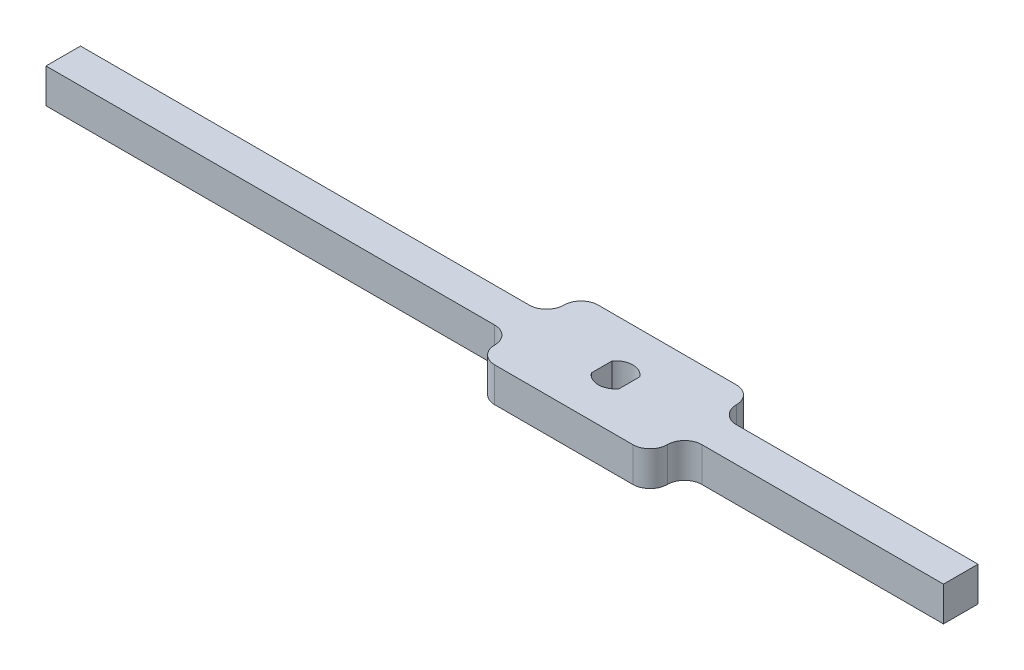
ISO-10303-21;
HEADER;
FILE_DESCRIPTION(('STEP AP214'),'2;1');
FILE_NAME('part.step','',(''),(''),'','','');
FILE_SCHEMA(('AUTOMOTIVE_DESIGN { 1 0 10303 214 1 1 1 1 }'));
ENDSEC;
DATA;
#1=APPLICATION_CONTEXT('core data for automotive mechanical design processes');
#2=APPLICATION_PROTOCOL_DEFINITION('international standard','automotive_design',2000,#1);
#3=PRODUCT_CONTEXT('',#1,'mechanical');
#4=PRODUCT('Part','Part','',(#3));
#5=PRODUCT_RELATED_PRODUCT_CATEGORY('part','',(#4));
#6=PRODUCT_DEFINITION_FORMATION('','',#4);
#7=PRODUCT_DEFINITION_CONTEXT('part definition',#1,'design');
#8=PRODUCT_DEFINITION('design','',#6,#7);
#9=PRODUCT_DEFINITION_SHAPE('','',#8);
#10=(LENGTH_UNIT() NAMED_UNIT(*) SI_UNIT(.MILLI.,.METRE.));
#11=(NAMED_UNIT(*) PLANE_ANGLE_UNIT() SI_UNIT($,.RADIAN.));
#12=(NAMED_UNIT(*) SI_UNIT($,.STERADIAN.) SOLID_ANGLE_UNIT());
#13=UNCERTAINTY_MEASURE_WITH_UNIT(LENGTH_MEASURE(1.E-05),#10,'distance_accuracy_value','');
#14=(GEOMETRIC_REPRESENTATION_CONTEXT(3) GLOBAL_UNCERTAINTY_ASSIGNED_CONTEXT((#13)) GLOBAL_UNIT_ASSIGNED_CONTEXT((#10,
#11,#12)) REPRESENTATION_CONTEXT('',''));
#15=CARTESIAN_POINT('',(0.,0.,0.));
#16=DIRECTION('',(0.,0.,1.));
#17=DIRECTION('',(1.,0.,0.));
#18=AXIS2_PLACEMENT_3D('',#15,#16,#17);
#19=CARTESIAN_POINT('',(0.,10.,0.));
#20=DIRECTION('',(0.,-1.,0.));
#21=DIRECTION('',(0.,0.,-1.));
#22=AXIS2_PLACEMENT_3D('',#19,#20,#21);
#23=PLANE('',#22);
#24=DIRECTION('',(1.,0.,0.));
#25=VECTOR('',#24,1.);
#26=CARTESIAN_POINT('',(-25.,10.,15.));
#27=LINE('',#26,#25);
#28=CARTESIAN_POINT('',(-20.,10.,15.));
#29=VERTEX_POINT('',#28);
#30=CARTESIAN_POINT('',(20.,10.,15.));
#31=VERTEX_POINT('',#30);
#32=EDGE_CURVE('E291',#29,#31,#27,.T.);
#33=ORIENTED_EDGE('',*,*,#32,.T.);
#34=CARTESIAN_POINT('',(20.,10.,10.));
#35=DIRECTION('',(0.,-1.,0.));
#36=DIRECTION('',(0.,0.,-1.));
#37=AXIS2_PLACEMENT_3D('',#34,#35,#36);
#38=CIRCLE('',#37,5.);
#39=CARTESIAN_POINT('',(25.,10.,9.99999999999998));
#40=VERTEX_POINT('',#39);
#41=EDGE_CURVE('E382',#31,#40,#38,.F.);
#42=ORIENTED_EDGE('',*,*,#41,.T.);
#43=CARTESIAN_POINT('',(30.,10.,9.99999999999998));
#44=DIRECTION('',(0.,-1.,0.));
#45=DIRECTION('',(0.,0.,-1.));
#46=AXIS2_PLACEMENT_3D('',#43,#44,#45);
#47=CIRCLE('',#46,5.);
#48=CARTESIAN_POINT('',(30.,10.,4.99999999999998));
#49=VERTEX_POINT('',#48);
#50=EDGE_CURVE('E352',#40,#49,#47,.T.);
#51=ORIENTED_EDGE('',*,*,#50,.T.);
#52=DIRECTION('',(1.,0.,0.));
#53=VECTOR('',#52,1.);
#54=CARTESIAN_POINT('',(25.,10.,4.99999999999998));
#55=LINE('',#54,#53);
#56=CARTESIAN_POINT('',(100.,10.,4.99999999999998));
#57=VERTEX_POINT('',#56);
#58=EDGE_CURVE('E216',#49,#57,#55,.T.);
#59=ORIENTED_EDGE('',*,*,#58,.T.);
#60=DIRECTION('',(0.,0.,-1.));
#61=VECTOR('',#60,1.);
#62=CARTESIAN_POINT('',(100.,10.,4.99999999999998));
#63=LINE('',#62,#61);
#64=CARTESIAN_POINT('',(100.,10.0000000000001,-5.00000000000002));
#65=VERTEX_POINT('',#64);
#66=EDGE_CURVE('E211',#57,#65,#63,.T.);
#67=ORIENTED_EDGE('',*,*,#66,.T.);
#68=DIRECTION('',(-1.,0.,0.));
#69=VECTOR('',#68,1.);
#70=CARTESIAN_POINT('',(100.,10.,-5.00000000000002));
#71=LINE('',#70,#69);
#72=CARTESIAN_POINT('',(30.,10.,-5.00000000000003));
#73=VERTEX_POINT('',#72);
#74=EDGE_CURVE('E195',#65,#73,#71,.T.);
#75=ORIENTED_EDGE('',*,*,#74,.T.);
#76=CARTESIAN_POINT('',(30.,10.,-10.));
#77=DIRECTION('',(0.,-1.,0.));
#78=DIRECTION('',(0.,0.,-1.));
#79=AXIS2_PLACEMENT_3D('',#76,#77,#78);
#80=CIRCLE('',#79,5.);
#81=CARTESIAN_POINT('',(25.,10.,-10.));
#82=VERTEX_POINT('',#81);
#83=EDGE_CURVE('E346',#73,#82,#80,.T.);
#84=ORIENTED_EDGE('',*,*,#83,.T.);
#85=CARTESIAN_POINT('',(20.,10.,-10.));
#86=DIRECTION('',(0.,-1.,0.));
#87=DIRECTION('',(0.,0.,-1.));
#88=AXIS2_PLACEMENT_3D('',#85,#86,#87);
#89=CIRCLE('',#88,5.);
#90=CARTESIAN_POINT('',(20.,10.,-15.));
#91=VERTEX_POINT('',#90);
#92=EDGE_CURVE('E59',#82,#91,#89,.F.);
#93=ORIENTED_EDGE('',*,*,#92,.T.);
#94=DIRECTION('',(-1.,0.,0.));
#95=VECTOR('',#94,1.);
#96=CARTESIAN_POINT('',(-25.,10.,-15.));
#97=LINE('',#96,#95);
#98=CARTESIAN_POINT('',(-20.,10.,-15.));
#99=VERTEX_POINT('',#98);
#100=EDGE_CURVE('E288',#91,#99,#97,.T.);
#101=ORIENTED_EDGE('',*,*,#100,.T.);
#102=CARTESIAN_POINT('',(-20.,10.,-10.));
#103=DIRECTION('',(0.,-1.,0.));
#104=DIRECTION('',(0.,0.,-1.));
#105=AXIS2_PLACEMENT_3D('',#102,#103,#104);
#106=CIRCLE('',#105,5.);
#107=CARTESIAN_POINT('',(-25.,10.,-10.));
#108=VERTEX_POINT('',#107);
#109=EDGE_CURVE('E376',#99,#108,#106,.F.);
#110=ORIENTED_EDGE('',*,*,#109,.T.);
#111=CARTESIAN_POINT('',(-30.,10.,-10.));
#112=DIRECTION('',(0.,-1.,0.));
#113=DIRECTION('',(0.,0.,-1.));
#114=AXIS2_PLACEMENT_3D('',#111,#112,#113);
#115=CIRCLE('',#114,5.);
#116=CARTESIAN_POINT('',(-30.,10.,-5.00000000000002));
#117=VERTEX_POINT('',#116);
#118=EDGE_CURVE('E341',#108,#117,#115,.T.);
#119=ORIENTED_EDGE('',*,*,#118,.T.);
#120=DIRECTION('',(-1.,0.,0.));
#121=VECTOR('',#120,1.);
#122=CARTESIAN_POINT('',(-160.,10.,-5.00000000000002));
#123=LINE('',#122,#121);
#124=CARTESIAN_POINT('',(-160.,10.,-5.00000000000002));
#125=VERTEX_POINT('',#124);
#126=EDGE_CURVE('E220',#117,#125,#123,.T.);
#127=ORIENTED_EDGE('',*,*,#126,.T.);
#128=DIRECTION('',(0.,0.,1.));
#129=VECTOR('',#128,1.);
#130=CARTESIAN_POINT('',(-160.,10.,4.99999999999998));
#131=LINE('',#130,#129);
#132=CARTESIAN_POINT('',(-160.,10.0000000000001,4.99999999999998));
#133=VERTEX_POINT('',#132);
#134=EDGE_CURVE('E217',#125,#133,#131,.T.);
#135=ORIENTED_EDGE('',*,*,#134,.T.);
#136=DIRECTION('',(1.,0.,0.));
#137=VECTOR('',#136,1.);
#138=CARTESIAN_POINT('',(-25.,10.,5.));
#139=LINE('',#138,#137);
#140=CARTESIAN_POINT('',(-30.,10.,5.));
#141=VERTEX_POINT('',#140);
#142=EDGE_CURVE('E224',#133,#141,#139,.T.);
#143=ORIENTED_EDGE('',*,*,#142,.T.);
#144=CARTESIAN_POINT('',(-30.,10.,10.));
#145=DIRECTION('',(0.,-1.,0.));
#146=DIRECTION('',(0.,0.,-1.));
#147=AXIS2_PLACEMENT_3D('',#144,#145,#146);
#148=CIRCLE('',#147,5.);
#149=CARTESIAN_POINT('',(-25.,10.,10.));
#150=VERTEX_POINT('',#149);
#151=EDGE_CURVE('E334',#141,#150,#148,.T.);
#152=ORIENTED_EDGE('',*,*,#151,.T.);
#153=CARTESIAN_POINT('',(-20.,10.,10.));
#154=DIRECTION('',(0.,-1.,0.));
#155=DIRECTION('',(0.,0.,-1.));
#156=AXIS2_PLACEMENT_3D('',#153,#154,#155);
#157=CIRCLE('',#156,5.);
#158=EDGE_CURVE('E379',#150,#29,#157,.F.);
#159=ORIENTED_EDGE('',*,*,#158,.T.);
#160=EDGE_LOOP('',(#33,#42,#51,#59,#67,#75,#84,#93,#101,#110,#119,#127,#135,#143,#152,#159));
#161=FACE_BOUND('',#160,.T.);
#162=CARTESIAN_POINT('',(0.,10.,0.));
#163=DIRECTION('',(0.,1.,0.));
#164=DIRECTION('',(0.,0.,1.));
#165=AXIS2_PLACEMENT_3D('',#162,#163,#164);
#166=CIRCLE('',#165,5.);
#167=CARTESIAN_POINT('',(4.,10.,-3.));
#168=VERTEX_POINT('',#167);
#169=CARTESIAN_POINT('',(-4.,10.,-3.));
#170=VERTEX_POINT('',#169);
#171=EDGE_CURVE('E245',#168,#170,#166,.T.);
#172=ORIENTED_EDGE('',*,*,#171,.F.);
#173=DIRECTION('',(0.,0.,-1.));
#174=VECTOR('',#173,1.);
#175=CARTESIAN_POINT('',(4.,10.,-3.));
#176=LINE('',#175,#174);
#177=CARTESIAN_POINT('',(4.,10.,3.));
#178=VERTEX_POINT('',#177);
#179=EDGE_CURVE('E256',#178,#168,#176,.T.);
#180=ORIENTED_EDGE('',*,*,#179,.F.);
#181=CARTESIAN_POINT('',(0.,10.,0.));
#182=DIRECTION('',(0.,1.,0.));
#183=DIRECTION('',(0.,0.,1.));
#184=AXIS2_PLACEMENT_3D('',#181,#182,#183);
#185=CIRCLE('',#184,5.);
#186=CARTESIAN_POINT('',(-4.,10.,3.));
#187=VERTEX_POINT('',#186);
#188=EDGE_CURVE('E252',#187,#178,#185,.T.);
#189=ORIENTED_EDGE('',*,*,#188,.F.);
#190=DIRECTION('',(0.,0.,1.));
#191=VECTOR('',#190,1.);
#192=CARTESIAN_POINT('',(-4.,10.,-3.));
#193=LINE('',#192,#191);
#194=EDGE_CURVE('E248',#170,#187,#193,.T.);
#195=ORIENTED_EDGE('',*,*,#194,.F.);
#196=EDGE_LOOP('',(#172,#180,#189,#195));
#197=FACE_BOUND('',#196,.T.);
#198=ADVANCED_FACE('F38',(#161,#197),#23,.F.);
#199=CARTESIAN_POINT('',(0.,0.,0.));
#200=DIRECTION('',(0.,-1.,0.));
#201=DIRECTION('',(0.,0.,-1.));
#202=AXIS2_PLACEMENT_3D('',#199,#200,#201);
#203=PLANE('',#202);
#204=CARTESIAN_POINT('',(30.,0.,9.99999999999998));
#205=DIRECTION('',(0.,-1.,0.));
#206=DIRECTION('',(0.,0.,-1.));
#207=AXIS2_PLACEMENT_3D('',#204,#205,#206);
#208=CIRCLE('',#207,5.);
#209=CARTESIAN_POINT('',(30.,0.,4.99999999999998));
#210=VERTEX_POINT('',#209);
#211=CARTESIAN_POINT('',(25.,0.,9.99999999999998));
#212=VERTEX_POINT('',#211);
#213=EDGE_CURVE('E349',#210,#212,#208,.F.);
#214=ORIENTED_EDGE('',*,*,#213,.T.);
#215=CARTESIAN_POINT('',(20.,0.,10.));
#216=DIRECTION('',(0.,-1.,0.));
#217=DIRECTION('',(0.,0.,-1.));
#218=AXIS2_PLACEMENT_3D('',#215,#216,#217);
#219=CIRCLE('',#218,5.);
#220=CARTESIAN_POINT('',(20.,0.,15.));
#221=VERTEX_POINT('',#220);
#222=EDGE_CURVE('E364',#212,#221,#219,.T.);
#223=ORIENTED_EDGE('',*,*,#222,.T.);
#224=DIRECTION('',(1.,0.,0.));
#225=VECTOR('',#224,1.);
#226=CARTESIAN_POINT('',(-25.,0.,15.));
#227=LINE('',#226,#225);
#228=CARTESIAN_POINT('',(-20.,0.,15.));
#229=VERTEX_POINT('',#228);
#230=EDGE_CURVE('E292',#229,#221,#227,.T.);
#231=ORIENTED_EDGE('',*,*,#230,.F.);
#232=CARTESIAN_POINT('',(-20.,0.,10.));
#233=DIRECTION('',(0.,-1.,0.));
#234=DIRECTION('',(0.,0.,-1.));
#235=AXIS2_PLACEMENT_3D('',#232,#233,#234);
#236=CIRCLE('',#235,5.);
#237=CARTESIAN_POINT('',(-25.,0.,10.));
#238=VERTEX_POINT('',#237);
#239=EDGE_CURVE('E361',#229,#238,#236,.T.);
#240=ORIENTED_EDGE('',*,*,#239,.T.);
#241=CARTESIAN_POINT('',(-30.,0.,10.));
#242=DIRECTION('',(0.,-1.,0.));
#243=DIRECTION('',(0.,0.,-1.));
#244=AXIS2_PLACEMENT_3D('',#241,#242,#243);
#245=CIRCLE('',#244,5.);
#246=CARTESIAN_POINT('',(-30.,0.,5.));
#247=VERTEX_POINT('',#246);
#248=EDGE_CURVE('E331',#238,#247,#245,.F.);
#249=ORIENTED_EDGE('',*,*,#248,.T.);
#250=DIRECTION('',(-1.,0.,0.));
#251=VECTOR('',#250,1.);
#252=CARTESIAN_POINT('',(-25.,0.,5.));
#253=LINE('',#252,#251);
#254=CARTESIAN_POINT('',(-160.,0.,4.99999999999998));
#255=VERTEX_POINT('',#254);
#256=EDGE_CURVE('E215',#247,#255,#253,.T.);
#257=ORIENTED_EDGE('',*,*,#256,.T.);
#258=DIRECTION('',(0.,0.,-1.));
#259=VECTOR('',#258,1.);
#260=CARTESIAN_POINT('',(-160.,0.,4.99999999999998));
#261=LINE('',#260,#259);
#262=CARTESIAN_POINT('',(-160.,0.,-5.00000000000002));
#263=VERTEX_POINT('',#262);
#264=EDGE_CURVE('E227',#255,#263,#261,.T.);
#265=ORIENTED_EDGE('',*,*,#264,.T.);
#266=DIRECTION('',(1.,0.,0.));
#267=VECTOR('',#266,1.);
#268=CARTESIAN_POINT('',(-160.,0.,-5.00000000000002));
#269=LINE('',#268,#267);
#270=CARTESIAN_POINT('',(-30.,0.,-5.00000000000002));
#271=VERTEX_POINT('',#270);
#272=EDGE_CURVE('E231',#263,#271,#269,.T.);
#273=ORIENTED_EDGE('',*,*,#272,.T.);
#274=CARTESIAN_POINT('',(-30.,0.,-10.));
#275=DIRECTION('',(0.,-1.,0.));
#276=DIRECTION('',(0.,0.,-1.));
#277=AXIS2_PLACEMENT_3D('',#274,#275,#276);
#278=CIRCLE('',#277,5.);
#279=CARTESIAN_POINT('',(-25.,0.,-10.));
#280=VERTEX_POINT('',#279);
#281=EDGE_CURVE('E337',#271,#280,#278,.F.);
#282=ORIENTED_EDGE('',*,*,#281,.T.);
#283=CARTESIAN_POINT('',(-20.,0.,-10.));
#284=DIRECTION('',(0.,-1.,0.));
#285=DIRECTION('',(0.,0.,-1.));
#286=AXIS2_PLACEMENT_3D('',#283,#284,#285);
#287=CIRCLE('',#286,5.);
#288=CARTESIAN_POINT('',(-20.,0.,-15.));
#289=VERTEX_POINT('',#288);
#290=EDGE_CURVE('E358',#280,#289,#287,.T.);
#291=ORIENTED_EDGE('',*,*,#290,.T.);
#292=DIRECTION('',(-1.,0.,0.));
#293=VECTOR('',#292,1.);
#294=CARTESIAN_POINT('',(-25.,0.,-15.));
#295=LINE('',#294,#293);
#296=CARTESIAN_POINT('',(20.,0.,-15.));
#297=VERTEX_POINT('',#296);
#298=EDGE_CURVE('E287',#297,#289,#295,.T.);
#299=ORIENTED_EDGE('',*,*,#298,.F.);
#300=CARTESIAN_POINT('',(20.,0.,-10.));
#301=DIRECTION('',(0.,-1.,0.));
#302=DIRECTION('',(0.,0.,-1.));
#303=AXIS2_PLACEMENT_3D('',#300,#301,#302);
#304=CIRCLE('',#303,5.);
#305=CARTESIAN_POINT('',(25.,0.,-10.));
#306=VERTEX_POINT('',#305);
#307=EDGE_CURVE('E355',#297,#306,#304,.T.);
#308=ORIENTED_EDGE('',*,*,#307,.T.);
#309=CARTESIAN_POINT('',(30.,0.,-10.));
#310=DIRECTION('',(0.,-1.,0.));
#311=DIRECTION('',(0.,0.,-1.));
#312=AXIS2_PLACEMENT_3D('',#309,#310,#311);
#313=CIRCLE('',#312,5.);
#314=CARTESIAN_POINT('',(30.,0.,-5.00000000000003));
#315=VERTEX_POINT('',#314);
#316=EDGE_CURVE('E185',#306,#315,#313,.F.);
#317=ORIENTED_EDGE('',*,*,#316,.T.);
#318=DIRECTION('',(1.,0.,0.));
#319=VECTOR('',#318,1.);
#320=CARTESIAN_POINT('',(100.,0.,-5.00000000000002));
#321=LINE('',#320,#319);
#322=CARTESIAN_POINT('',(100.,0.,-5.00000000000002));
#323=VERTEX_POINT('',#322);
#324=EDGE_CURVE('E175',#315,#323,#321,.T.);
#325=ORIENTED_EDGE('',*,*,#324,.T.);
#326=DIRECTION('',(0.,0.,1.));
#327=VECTOR('',#326,1.);
#328=CARTESIAN_POINT('',(100.,0.,4.99999999999998));
#329=LINE('',#328,#327);
#330=CARTESIAN_POINT('',(100.,0.,4.99999999999998));
#331=VERTEX_POINT('',#330);
#332=EDGE_CURVE('E182',#323,#331,#329,.T.);
#333=ORIENTED_EDGE('',*,*,#332,.T.);
#334=DIRECTION('',(-1.,0.,0.));
#335=VECTOR('',#334,1.);
#336=CARTESIAN_POINT('',(25.,0.,4.99999999999998));
#337=LINE('',#336,#335);
#338=EDGE_CURVE('E200',#331,#210,#337,.T.);
#339=ORIENTED_EDGE('',*,*,#338,.T.);
#340=EDGE_LOOP('',(#214,#223,#231,#240,#249,#257,#265,#273,#282,#291,#299,#308,#317,#325,#333,#339));
#341=FACE_BOUND('',#340,.T.);
#342=DIRECTION('',(0.,0.,-1.));
#343=VECTOR('',#342,1.);
#344=CARTESIAN_POINT('',(4.,0.,-3.));
#345=LINE('',#344,#343);
#346=CARTESIAN_POINT('',(4.,0.,3.));
#347=VERTEX_POINT('',#346);
#348=CARTESIAN_POINT('',(4.,0.,-3.));
#349=VERTEX_POINT('',#348);
#350=EDGE_CURVE('E249',#347,#349,#345,.T.);
#351=ORIENTED_EDGE('',*,*,#350,.T.);
#352=CARTESIAN_POINT('',(0.,0.,0.));
#353=DIRECTION('',(0.,1.,0.));
#354=DIRECTION('',(0.,0.,1.));
#355=AXIS2_PLACEMENT_3D('',#352,#353,#354);
#356=CIRCLE('',#355,5.);
#357=CARTESIAN_POINT('',(-4.,0.,-3.));
#358=VERTEX_POINT('',#357);
#359=EDGE_CURVE('E244',#349,#358,#356,.T.);
#360=ORIENTED_EDGE('',*,*,#359,.T.);
#361=DIRECTION('',(0.,0.,1.));
#362=VECTOR('',#361,1.);
#363=CARTESIAN_POINT('',(-4.,0.,-3.));
#364=LINE('',#363,#362);
#365=CARTESIAN_POINT('',(-4.,0.,3.));
#366=VERTEX_POINT('',#365);
#367=EDGE_CURVE('E263',#358,#366,#364,.T.);
#368=ORIENTED_EDGE('',*,*,#367,.T.);
#369=CARTESIAN_POINT('',(0.,0.,0.));
#370=DIRECTION('',(0.,1.,0.));
#371=DIRECTION('',(0.,0.,1.));
#372=AXIS2_PLACEMENT_3D('',#369,#370,#371);
#373=CIRCLE('',#372,5.);
#374=EDGE_CURVE('E267',#366,#347,#373,.T.);
#375=ORIENTED_EDGE('',*,*,#374,.T.);
#376=EDGE_LOOP('',(#351,#360,#368,#375));
#377=FACE_BOUND('',#376,.T.);
#378=ADVANCED_FACE('F178',(#341,#377),#203,.T.);
#379=CARTESIAN_POINT('',(-25.,10.,-15.));
#380=DIRECTION('',(0.,0.,1.));
#381=DIRECTION('',(1.,0.,0.));
#382=AXIS2_PLACEMENT_3D('',#379,#380,#381);
#383=PLANE('',#382);
#384=ORIENTED_EDGE('',*,*,#298,.T.);
#385=DIRECTION('',(0.,-1.,0.));
#386=VECTOR('',#385,1.);
#387=CARTESIAN_POINT('',(-20.,10.,-15.));
#388=LINE('',#387,#386);
#389=EDGE_CURVE('E11',#289,#99,#388,.F.);
#390=ORIENTED_EDGE('',*,*,#389,.T.);
#391=ORIENTED_EDGE('',*,*,#100,.F.);
#392=DIRECTION('',(0.,-1.,0.));
#393=VECTOR('',#392,1.);
#394=CARTESIAN_POINT('',(20.,10.,-15.));
#395=LINE('',#394,#393);
#396=EDGE_CURVE('E47',#91,#297,#395,.T.);
#397=ORIENTED_EDGE('',*,*,#396,.T.);
#398=EDGE_LOOP('',(#384,#390,#391,#397));
#399=FACE_BOUND('',#398,.T.);
#400=ADVANCED_FACE('F388',(#399),#383,.F.);
#401=CARTESIAN_POINT('',(-25.,10.,15.));
#402=DIRECTION('',(0.,0.,-1.));
#403=DIRECTION('',(-1.,0.,0.));
#404=AXIS2_PLACEMENT_3D('',#401,#402,#403);
#405=PLANE('',#404);
#406=ORIENTED_EDGE('',*,*,#230,.T.);
#407=DIRECTION('',(0.,-1.,0.));
#408=VECTOR('',#407,1.);
#409=CARTESIAN_POINT('',(20.,10.,15.));
#410=LINE('',#409,#408);
#411=EDGE_CURVE('E371',#221,#31,#410,.F.);
#412=ORIENTED_EDGE('',*,*,#411,.T.);
#413=ORIENTED_EDGE('',*,*,#32,.F.);
#414=DIRECTION('',(0.,-1.,0.));
#415=VECTOR('',#414,1.);
#416=CARTESIAN_POINT('',(-20.,10.,15.));
#417=LINE('',#416,#415);
#418=EDGE_CURVE('E367',#29,#229,#417,.T.);
#419=ORIENTED_EDGE('',*,*,#418,.T.);
#420=EDGE_LOOP('',(#406,#412,#413,#419));
#421=FACE_BOUND('',#420,.T.);
#422=ADVANCED_FACE('F425',(#421),#405,.F.);
#423=CARTESIAN_POINT('',(0.,10.,0.));
#424=DIRECTION('',(0.,-1.,0.));
#425=DIRECTION('',(0.,0.,-1.));
#426=AXIS2_PLACEMENT_3D('',#423,#424,#425);
#427=CYLINDRICAL_SURFACE('',#426,5.);
#428=ORIENTED_EDGE('',*,*,#359,.F.);
#429=DIRECTION('',(0.,-1.,0.));
#430=VECTOR('',#429,1.);
#431=CARTESIAN_POINT('',(4.,10.,-3.));
#432=LINE('',#431,#430);
#433=EDGE_CURVE('E259',#168,#349,#432,.T.);
#434=ORIENTED_EDGE('',*,*,#433,.F.);
#435=ORIENTED_EDGE('',*,*,#171,.T.);
#436=DIRECTION('',(0.,-1.,0.));
#437=VECTOR('',#436,1.);
#438=CARTESIAN_POINT('',(-4.,10.,-3.));
#439=LINE('',#438,#437);
#440=EDGE_CURVE('E283',#170,#358,#439,.T.);
#441=ORIENTED_EDGE('',*,*,#440,.T.);
#442=EDGE_LOOP('',(#428,#434,#435,#441));
#443=FACE_BOUND('',#442,.T.);
#444=ADVANCED_FACE('F455',(#443),#427,.F.);
#445=CARTESIAN_POINT('',(-4.,10.,-3.));
#446=DIRECTION('',(1.,0.,0.));
#447=DIRECTION('',(0.,0.,-1.));
#448=AXIS2_PLACEMENT_3D('',#445,#446,#447);
#449=PLANE('',#448);
#450=ORIENTED_EDGE('',*,*,#367,.F.);
#451=ORIENTED_EDGE('',*,*,#440,.F.);
#452=ORIENTED_EDGE('',*,*,#194,.T.);
#453=DIRECTION('',(0.,-1.,0.));
#454=VECTOR('',#453,1.);
#455=CARTESIAN_POINT('',(-4.,10.,3.));
#456=LINE('',#455,#454);
#457=EDGE_CURVE('E280',#187,#366,#456,.T.);
#458=ORIENTED_EDGE('',*,*,#457,.T.);
#459=EDGE_LOOP('',(#450,#451,#452,#458));
#460=FACE_BOUND('',#459,.T.);
#461=ADVANCED_FACE('F612',(#460),#449,.T.);
#462=CARTESIAN_POINT('',(0.,10.,0.));
#463=DIRECTION('',(0.,-1.,0.));
#464=DIRECTION('',(0.,0.,-1.));
#465=AXIS2_PLACEMENT_3D('',#462,#463,#464);
#466=CYLINDRICAL_SURFACE('',#465,5.);
#467=ORIENTED_EDGE('',*,*,#374,.F.);
#468=ORIENTED_EDGE('',*,*,#457,.F.);
#469=ORIENTED_EDGE('',*,*,#188,.T.);
#470=DIRECTION('',(0.,-1.,0.));
#471=VECTOR('',#470,1.);
#472=CARTESIAN_POINT('',(4.,10.,3.));
#473=LINE('',#472,#471);
#474=EDGE_CURVE('E277',#178,#347,#473,.T.);
#475=ORIENTED_EDGE('',*,*,#474,.T.);
#476=EDGE_LOOP('',(#467,#468,#469,#475));
#477=FACE_BOUND('',#476,.T.);
#478=ADVANCED_FACE('F603',(#477),#466,.F.);
#479=CARTESIAN_POINT('',(4.,10.,-3.));
#480=DIRECTION('',(-1.,0.,0.));
#481=DIRECTION('',(0.,0.,1.));
#482=AXIS2_PLACEMENT_3D('',#479,#480,#481);
#483=PLANE('',#482);
#484=ORIENTED_EDGE('',*,*,#350,.F.);
#485=ORIENTED_EDGE('',*,*,#474,.F.);
#486=ORIENTED_EDGE('',*,*,#179,.T.);
#487=ORIENTED_EDGE('',*,*,#433,.T.);
#488=EDGE_LOOP('',(#484,#485,#486,#487));
#489=FACE_BOUND('',#488,.T.);
#490=ADVANCED_FACE('F583',(#489),#483,.T.);
#491=CARTESIAN_POINT('',(-160.,145.369863706809,-5.00000000000002));
#492=DIRECTION('',(0.,0.,-1.));
#493=DIRECTION('',(-1.,0.,0.));
#494=AXIS2_PLACEMENT_3D('',#491,#492,#493);
#495=PLANE('',#494);
#496=ORIENTED_EDGE('',*,*,#126,.F.);
#497=DIRECTION('',(0.,-1.,0.));
#498=VECTOR('',#497,1.);
#499=CARTESIAN_POINT('',(-30.,145.369863706809,-5.00000000000002));
#500=LINE('',#499,#498);
#501=EDGE_CURVE('E308',#117,#271,#500,.T.);
#502=ORIENTED_EDGE('',*,*,#501,.T.);
#503=ORIENTED_EDGE('',*,*,#272,.F.);
#504=DIRECTION('',(0.,-1.,0.));
#505=VECTOR('',#504,1.);
#506=CARTESIAN_POINT('',(-160.,145.369863706809,-5.00000000000002));
#507=LINE('',#506,#505);
#508=EDGE_CURVE('E221',#125,#263,#507,.T.);
#509=ORIENTED_EDGE('',*,*,#508,.F.);
#510=EDGE_LOOP('',(#496,#502,#503,#509));
#511=FACE_BOUND('',#510,.T.);
#512=ADVANCED_FACE('F402',(#511),#495,.T.);
#513=CARTESIAN_POINT('',(-160.,145.369863706809,4.99999999999998));
#514=DIRECTION('',(-1.,0.,0.));
#515=DIRECTION('',(0.,0.,1.));
#516=AXIS2_PLACEMENT_3D('',#513,#514,#515);
#517=PLANE('',#516);
#518=ORIENTED_EDGE('',*,*,#134,.F.);
#519=ORIENTED_EDGE('',*,*,#508,.T.);
#520=ORIENTED_EDGE('',*,*,#264,.F.);
#521=DIRECTION('',(0.,-1.,0.));
#522=VECTOR('',#521,1.);
#523=CARTESIAN_POINT('',(-160.,145.369863706809,4.99999999999998));
#524=LINE('',#523,#522);
#525=EDGE_CURVE('E235',#133,#255,#524,.T.);
#526=ORIENTED_EDGE('',*,*,#525,.F.);
#527=EDGE_LOOP('',(#518,#519,#520,#526));
#528=FACE_BOUND('',#527,.T.);
#529=ADVANCED_FACE('F409',(#528),#517,.T.);
#530=CARTESIAN_POINT('',(-25.,145.369863706809,5.));
#531=DIRECTION('',(0.,0.,1.));
#532=DIRECTION('',(1.,0.,0.));
#533=AXIS2_PLACEMENT_3D('',#530,#531,#532);
#534=PLANE('',#533);
#535=ORIENTED_EDGE('',*,*,#256,.F.);
#536=DIRECTION('',(0.,-1.,0.));
#537=VECTOR('',#536,1.);
#538=CARTESIAN_POINT('',(-30.,145.369863706809,5.));
#539=LINE('',#538,#537);
#540=EDGE_CURVE('E305',#247,#141,#539,.F.);
#541=ORIENTED_EDGE('',*,*,#540,.T.);
#542=ORIENTED_EDGE('',*,*,#142,.F.);
#543=ORIENTED_EDGE('',*,*,#525,.T.);
#544=EDGE_LOOP('',(#535,#541,#542,#543));
#545=FACE_BOUND('',#544,.T.);
#546=ADVANCED_FACE('F438',(#545),#534,.T.);
#547=CARTESIAN_POINT('',(25.,145.369863706809,4.99999999999998));
#548=DIRECTION('',(0.,0.,1.));
#549=DIRECTION('',(1.,0.,0.));
#550=AXIS2_PLACEMENT_3D('',#547,#548,#549);
#551=PLANE('',#550);
#552=ORIENTED_EDGE('',*,*,#58,.F.);
#553=DIRECTION('',(0.,-1.,0.));
#554=VECTOR('',#553,1.);
#555=CARTESIAN_POINT('',(30.,145.369863706809,4.99999999999998));
#556=LINE('',#555,#554);
#557=EDGE_CURVE('E323',#49,#210,#556,.T.);
#558=ORIENTED_EDGE('',*,*,#557,.T.);
#559=ORIENTED_EDGE('',*,*,#338,.F.);
#560=DIRECTION('',(0.,-1.,0.));
#561=VECTOR('',#560,1.);
#562=CARTESIAN_POINT('',(100.,145.369863706809,4.99999999999998));
#563=LINE('',#562,#561);
#564=EDGE_CURVE('E199',#57,#331,#563,.T.);
#565=ORIENTED_EDGE('',*,*,#564,.F.);
#566=EDGE_LOOP('',(#552,#558,#559,#565));
#567=FACE_BOUND('',#566,.T.);
#568=ADVANCED_FACE('F437',(#567),#551,.T.);
#569=CARTESIAN_POINT('',(100.,145.369863706809,4.99999999999998));
#570=DIRECTION('',(1.,0.,0.));
#571=DIRECTION('',(0.,0.,-1.));
#572=AXIS2_PLACEMENT_3D('',#569,#570,#571);
#573=PLANE('',#572);
#574=ORIENTED_EDGE('',*,*,#66,.F.);
#575=ORIENTED_EDGE('',*,*,#564,.T.);
#576=ORIENTED_EDGE('',*,*,#332,.F.);
#577=DIRECTION('',(0.,-1.,0.));
#578=VECTOR('',#577,1.);
#579=CARTESIAN_POINT('',(100.,145.369863706809,-5.00000000000002));
#580=LINE('',#579,#578);
#581=EDGE_CURVE('E192',#65,#323,#580,.T.);
#582=ORIENTED_EDGE('',*,*,#581,.F.);
#583=EDGE_LOOP('',(#574,#575,#576,#582));
#584=FACE_BOUND('',#583,.T.);
#585=ADVANCED_FACE('F202',(#584),#573,.T.);
#586=CARTESIAN_POINT('',(100.,145.369863706809,-5.00000000000002));
#587=DIRECTION('',(0.,0.,-1.));
#588=DIRECTION('',(-1.,0.,0.));
#589=AXIS2_PLACEMENT_3D('',#586,#587,#588);
#590=PLANE('',#589);
#591=ORIENTED_EDGE('',*,*,#324,.F.);
#592=DIRECTION('',(0.,-1.,0.));
#593=VECTOR('',#592,1.);
#594=CARTESIAN_POINT('',(30.,145.369863706809,-5.00000000000003));
#595=LINE('',#594,#593);
#596=EDGE_CURVE('E320',#315,#73,#595,.F.);
#597=ORIENTED_EDGE('',*,*,#596,.T.);
#598=ORIENTED_EDGE('',*,*,#74,.F.);
#599=ORIENTED_EDGE('',*,*,#581,.T.);
#600=EDGE_LOOP('',(#591,#597,#598,#599));
#601=FACE_BOUND('',#600,.T.);
#602=ADVANCED_FACE('F193',(#601),#590,.T.);
#603=CARTESIAN_POINT('',(-30.,10.,10.));
#604=DIRECTION('',(0.,-1.,0.));
#605=DIRECTION('',(0.,0.,-1.));
#606=AXIS2_PLACEMENT_3D('',#603,#604,#605);
#607=CYLINDRICAL_SURFACE('',#606,5.);
#608=ORIENTED_EDGE('',*,*,#151,.F.);
#609=ORIENTED_EDGE('',*,*,#540,.F.);
#610=ORIENTED_EDGE('',*,*,#248,.F.);
#611=DIRECTION('',(0.,-1.,0.));
#612=VECTOR('',#611,1.);
#613=CARTESIAN_POINT('',(-25.,10.,10.));
#614=LINE('',#613,#612);
#615=EDGE_CURVE('E296',#150,#238,#614,.T.);
#616=ORIENTED_EDGE('',*,*,#615,.F.);
#617=EDGE_LOOP('',(#608,#609,#610,#616));
#618=FACE_BOUND('',#617,.T.);
#619=ADVANCED_FACE('F416',(#618),#607,.F.);
#620=CARTESIAN_POINT('',(-30.,145.369863706809,-10.));
#621=DIRECTION('',(0.,-1.,0.));
#622=DIRECTION('',(0.,0.,-1.));
#623=AXIS2_PLACEMENT_3D('',#620,#621,#622);
#624=CYLINDRICAL_SURFACE('',#623,5.);
#625=ORIENTED_EDGE('',*,*,#118,.F.);
#626=DIRECTION('',(0.,-1.,0.));
#627=VECTOR('',#626,1.);
#628=CARTESIAN_POINT('',(-25.,10.,-10.));
#629=LINE('',#628,#627);
#630=EDGE_CURVE('E312',#280,#108,#629,.F.);
#631=ORIENTED_EDGE('',*,*,#630,.F.);
#632=ORIENTED_EDGE('',*,*,#281,.F.);
#633=ORIENTED_EDGE('',*,*,#501,.F.);
#634=EDGE_LOOP('',(#625,#631,#632,#633));
#635=FACE_BOUND('',#634,.T.);
#636=ADVANCED_FACE('F399',(#635),#624,.F.);
#637=CARTESIAN_POINT('',(30.,10.,-10.));
#638=DIRECTION('',(0.,-1.,0.));
#639=DIRECTION('',(0.,0.,-1.));
#640=AXIS2_PLACEMENT_3D('',#637,#638,#639);
#641=CYLINDRICAL_SURFACE('',#640,5.);
#642=ORIENTED_EDGE('',*,*,#83,.F.);
#643=ORIENTED_EDGE('',*,*,#596,.F.);
#644=ORIENTED_EDGE('',*,*,#316,.F.);
#645=DIRECTION('',(0.,-1.,0.));
#646=VECTOR('',#645,1.);
#647=CARTESIAN_POINT('',(25.,10.,-10.));
#648=LINE('',#647,#646);
#649=EDGE_CURVE('E316',#82,#306,#648,.T.);
#650=ORIENTED_EDGE('',*,*,#649,.F.);
#651=EDGE_LOOP('',(#642,#643,#644,#650));
#652=FACE_BOUND('',#651,.T.);
#653=ADVANCED_FACE('F466',(#652),#641,.F.);
#654=CARTESIAN_POINT('',(30.,145.369863706809,9.99999999999998));
#655=DIRECTION('',(0.,-1.,0.));
#656=DIRECTION('',(0.,0.,-1.));
#657=AXIS2_PLACEMENT_3D('',#654,#655,#656);
#658=CYLINDRICAL_SURFACE('',#657,5.);
#659=ORIENTED_EDGE('',*,*,#50,.F.);
#660=DIRECTION('',(0.,-1.,0.));
#661=VECTOR('',#660,1.);
#662=CARTESIAN_POINT('',(25.,10.,9.99999999999998));
#663=LINE('',#662,#661);
#664=EDGE_CURVE('E327',#212,#40,#663,.F.);
#665=ORIENTED_EDGE('',*,*,#664,.F.);
#666=ORIENTED_EDGE('',*,*,#213,.F.);
#667=ORIENTED_EDGE('',*,*,#557,.F.);
#668=EDGE_LOOP('',(#659,#665,#666,#667));
#669=FACE_BOUND('',#668,.T.);
#670=ADVANCED_FACE('F435',(#669),#658,.F.);
#671=CARTESIAN_POINT('',(20.,10.,10.));
#672=DIRECTION('',(0.,-1.,0.));
#673=DIRECTION('',(0.,0.,-1.));
#674=AXIS2_PLACEMENT_3D('',#671,#672,#673);
#675=CYLINDRICAL_SURFACE('',#674,5.);
#676=ORIENTED_EDGE('',*,*,#41,.F.);
#677=ORIENTED_EDGE('',*,*,#411,.F.);
#678=ORIENTED_EDGE('',*,*,#222,.F.);
#679=ORIENTED_EDGE('',*,*,#664,.T.);
#680=EDGE_LOOP('',(#676,#677,#678,#679));
#681=FACE_BOUND('',#680,.T.);
#682=ADVANCED_FACE('F429',(#681),#675,.T.);
#683=CARTESIAN_POINT('',(-20.,10.,10.));
#684=DIRECTION('',(0.,-1.,0.));
#685=DIRECTION('',(0.,0.,-1.));
#686=AXIS2_PLACEMENT_3D('',#683,#684,#685);
#687=CYLINDRICAL_SURFACE('',#686,5.);
#688=ORIENTED_EDGE('',*,*,#158,.F.);
#689=ORIENTED_EDGE('',*,*,#615,.T.);
#690=ORIENTED_EDGE('',*,*,#239,.F.);
#691=ORIENTED_EDGE('',*,*,#418,.F.);
#692=EDGE_LOOP('',(#688,#689,#690,#691));
#693=FACE_BOUND('',#692,.T.);
#694=ADVANCED_FACE('F421',(#693),#687,.T.);
#695=CARTESIAN_POINT('',(-20.,10.,-10.));
#696=DIRECTION('',(0.,-1.,0.));
#697=DIRECTION('',(0.,0.,-1.));
#698=AXIS2_PLACEMENT_3D('',#695,#696,#697);
#699=CYLINDRICAL_SURFACE('',#698,5.);
#700=ORIENTED_EDGE('',*,*,#109,.F.);
#701=ORIENTED_EDGE('',*,*,#389,.F.);
#702=ORIENTED_EDGE('',*,*,#290,.F.);
#703=ORIENTED_EDGE('',*,*,#630,.T.);
#704=EDGE_LOOP('',(#700,#701,#702,#703));
#705=FACE_BOUND('',#704,.T.);
#706=ADVANCED_FACE('F393',(#705),#699,.T.);
#707=CARTESIAN_POINT('',(20.,10.,-10.));
#708=DIRECTION('',(0.,-1.,0.));
#709=DIRECTION('',(0.,0.,-1.));
#710=AXIS2_PLACEMENT_3D('',#707,#708,#709);
#711=CYLINDRICAL_SURFACE('',#710,5.);
#712=ORIENTED_EDGE('',*,*,#92,.F.);
#713=ORIENTED_EDGE('',*,*,#649,.T.);
#714=ORIENTED_EDGE('',*,*,#307,.F.);
#715=ORIENTED_EDGE('',*,*,#396,.F.);
#716=EDGE_LOOP('',(#712,#713,#714,#715));
#717=FACE_BOUND('',#716,.T.);
#718=ADVANCED_FACE('F40',(#717),#711,.T.);
#719=CLOSED_SHELL('',(#198,#378,#400,#422,#444,#461,#478,#490,#512,#529,#546,#568,#585,#602,
#619,#636,#653,#670,#682,#694,#706,#718));
#720=MANIFOLD_SOLID_BREP('B2',#719);
#721=ADVANCED_BREP_SHAPE_REPRESENTATION('',(#18,#720),#14);
#722=SHAPE_DEFINITION_REPRESENTATION(#9,#721);
ENDSEC;
END-ISO-10303-21;
